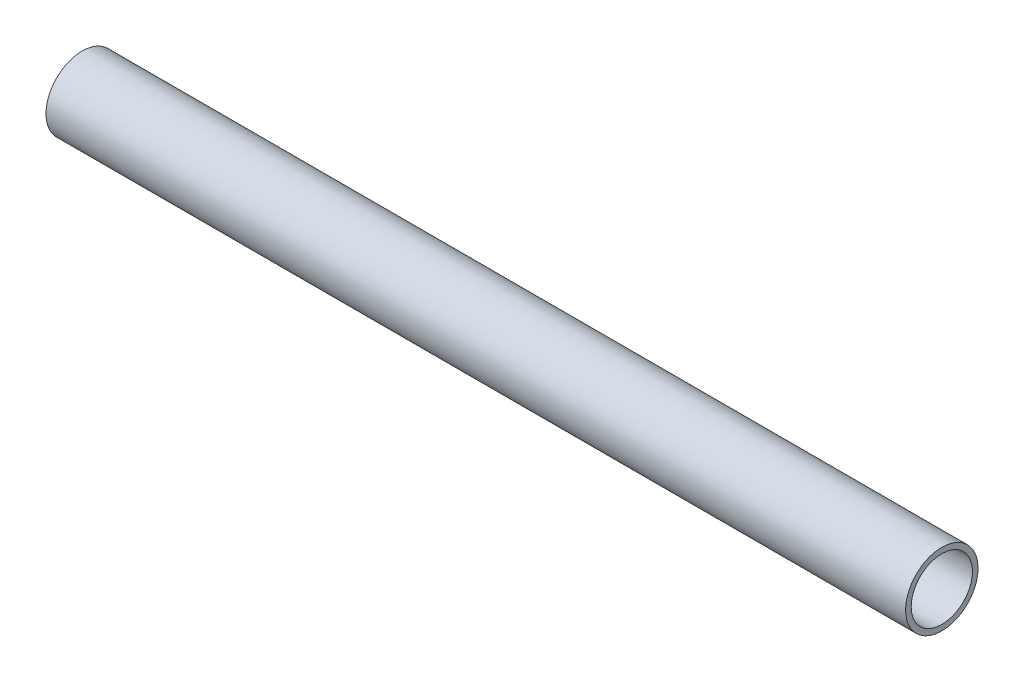
ISO-10303-21;
HEADER;
FILE_DESCRIPTION(('STEP AP214'),'2;1');
FILE_NAME('part.step','',(''),(''),'','','');
FILE_SCHEMA(('AUTOMOTIVE_DESIGN { 1 0 10303 214 1 1 1 1 }'));
ENDSEC;
DATA;
#1=APPLICATION_CONTEXT('core data for automotive mechanical design processes');
#2=APPLICATION_PROTOCOL_DEFINITION('international standard','automotive_design',2000,#1);
#3=PRODUCT_CONTEXT('',#1,'mechanical');
#4=PRODUCT('Part','Part','',(#3));
#5=PRODUCT_RELATED_PRODUCT_CATEGORY('part','',(#4));
#6=PRODUCT_DEFINITION_FORMATION('','',#4);
#7=PRODUCT_DEFINITION_CONTEXT('part definition',#1,'design');
#8=PRODUCT_DEFINITION('design','',#6,#7);
#9=PRODUCT_DEFINITION_SHAPE('','',#8);
#10=(LENGTH_UNIT() NAMED_UNIT(*) SI_UNIT(.MILLI.,.METRE.));
#11=(NAMED_UNIT(*) PLANE_ANGLE_UNIT() SI_UNIT($,.RADIAN.));
#12=(NAMED_UNIT(*) SI_UNIT($,.STERADIAN.) SOLID_ANGLE_UNIT());
#13=UNCERTAINTY_MEASURE_WITH_UNIT(LENGTH_MEASURE(1.E-05),#10,'distance_accuracy_value','');
#14=(GEOMETRIC_REPRESENTATION_CONTEXT(3) GLOBAL_UNCERTAINTY_ASSIGNED_CONTEXT((#13)) GLOBAL_UNIT_ASSIGNED_CONTEXT((#10,
#11,#12)) REPRESENTATION_CONTEXT('',''));
#15=CARTESIAN_POINT('',(0.,0.,0.));
#16=DIRECTION('',(0.,0.,1.));
#17=DIRECTION('',(1.,0.,0.));
#18=AXIS2_PLACEMENT_3D('',#15,#16,#17);
#19=CARTESIAN_POINT('',(42.0243,0.,0.));
#20=DIRECTION('',(1.,0.,0.));
#21=DIRECTION('',(0.,0.,-1.));
#22=AXIS2_PLACEMENT_3D('',#19,#20,#21);
#23=PLANE('',#22);
#24=CARTESIAN_POINT('',(42.0243,0.,0.));
#25=DIRECTION('',(1.,0.,0.));
#26=DIRECTION('',(0.,0.,-1.));
#27=AXIS2_PLACEMENT_3D('',#24,#25,#26);
#28=CIRCLE('',#27,3.5433);
#29=CARTESIAN_POINT('',(42.0243,0.,3.5433));
#30=VERTEX_POINT('',#29);
#31=EDGE_CURVE('E10',#30,#30,#28,.T.);
#32=ORIENTED_EDGE('',*,*,#31,.T.);
#33=EDGE_LOOP('',(#32));
#34=FACE_BOUND('',#33,.T.);
#35=CARTESIAN_POINT('',(42.0243,0.,0.));
#36=DIRECTION('',(1.,0.,0.));
#37=DIRECTION('',(0.,0.,-1.));
#38=AXIS2_PLACEMENT_3D('',#35,#36,#37);
#39=CIRCLE('',#38,2.99466);
#40=CARTESIAN_POINT('',(42.0243,0.,2.99466));
#41=VERTEX_POINT('',#40);
#42=EDGE_CURVE('E44',#41,#41,#39,.T.);
#43=ORIENTED_EDGE('',*,*,#42,.F.);
#44=EDGE_LOOP('',(#43));
#45=FACE_BOUND('',#44,.T.);
#46=ADVANCED_FACE('F33',(#34,#45),#23,.T.);
#47=CARTESIAN_POINT('',(-42.0243,0.,0.));
#48=DIRECTION('',(1.,0.,0.));
#49=DIRECTION('',(0.,0.,-1.));
#50=AXIS2_PLACEMENT_3D('',#47,#48,#49);
#51=PLANE('',#50);
#52=CARTESIAN_POINT('',(-42.0243,0.,0.));
#53=DIRECTION('',(1.,0.,0.));
#54=DIRECTION('',(0.,0.,-1.));
#55=AXIS2_PLACEMENT_3D('',#52,#53,#54);
#56=CIRCLE('',#55,3.5433);
#57=CARTESIAN_POINT('',(-42.0243,0.,3.5433));
#58=VERTEX_POINT('',#57);
#59=EDGE_CURVE('E37',#58,#58,#56,.T.);
#60=ORIENTED_EDGE('',*,*,#59,.F.);
#61=EDGE_LOOP('',(#60));
#62=FACE_BOUND('',#61,.T.);
#63=CARTESIAN_POINT('',(-42.0243,0.,0.));
#64=DIRECTION('',(1.,0.,0.));
#65=DIRECTION('',(0.,0.,-1.));
#66=AXIS2_PLACEMENT_3D('',#63,#64,#65);
#67=CIRCLE('',#66,2.99466);
#68=CARTESIAN_POINT('',(-42.0243,0.,2.99466));
#69=VERTEX_POINT('',#68);
#70=EDGE_CURVE('E46',#69,#69,#67,.T.);
#71=ORIENTED_EDGE('',*,*,#70,.T.);
#72=EDGE_LOOP('',(#71));
#73=FACE_BOUND('',#72,.T.);
#74=ADVANCED_FACE('F56',(#62,#73),#51,.F.);
#75=CARTESIAN_POINT('',(42.0243,0.,0.));
#76=DIRECTION('',(-1.,0.,0.));
#77=DIRECTION('',(0.,0.,1.));
#78=AXIS2_PLACEMENT_3D('',#75,#76,#77);
#79=CYLINDRICAL_SURFACE('',#78,3.5433);
#80=CARTESIAN_POINT('',(42.0243,0.,3.5433));
#81=CARTESIAN_POINT('',(41.14879375,0.,3.5433));
#82=CARTESIAN_POINT('',(40.2732875,0.,3.5433));
#83=CARTESIAN_POINT('',(38.522275,0.,3.5433));
#84=CARTESIAN_POINT('',(37.64676875,0.,3.5433));
#85=CARTESIAN_POINT('',(35.89575625,0.,3.5433));
#86=CARTESIAN_POINT('',(35.02025,0.,3.5433));
#87=CARTESIAN_POINT('',(33.2692375,0.,3.5433));
#88=CARTESIAN_POINT('',(32.39373125,0.,3.5433));
#89=CARTESIAN_POINT('',(30.64271875,0.,3.5433));
#90=CARTESIAN_POINT('',(29.7672125,0.,3.5433));
#91=CARTESIAN_POINT('',(28.0162,0.,3.5433));
#92=CARTESIAN_POINT('',(27.14069375,0.,3.5433));
#93=CARTESIAN_POINT('',(25.38968125,0.,3.5433));
#94=CARTESIAN_POINT('',(24.514175,0.,3.5433));
#95=CARTESIAN_POINT('',(22.7631625,0.,3.5433));
#96=CARTESIAN_POINT('',(21.88765625,0.,3.5433));
#97=CARTESIAN_POINT('',(20.13664375,0.,3.5433));
#98=CARTESIAN_POINT('',(19.2611375,0.,3.5433));
#99=CARTESIAN_POINT('',(17.510125,0.,3.5433));
#100=CARTESIAN_POINT('',(16.63461875,0.,3.5433));
#101=CARTESIAN_POINT('',(14.88360625,0.,3.5433));
#102=CARTESIAN_POINT('',(14.0081,0.,3.5433));
#103=CARTESIAN_POINT('',(12.2570875,0.,3.5433));
#104=CARTESIAN_POINT('',(11.38158125,0.,3.5433));
#105=CARTESIAN_POINT('',(9.63056875,0.,3.5433));
#106=CARTESIAN_POINT('',(8.7550625,0.,3.5433));
#107=CARTESIAN_POINT('',(7.00405,0.,3.5433));
#108=CARTESIAN_POINT('',(6.12854375,0.,3.5433));
#109=CARTESIAN_POINT('',(4.37753124999999,0.,3.5433));
#110=CARTESIAN_POINT('',(3.50202499999999,0.,3.5433));
#111=CARTESIAN_POINT('',(1.75101249999999,0.,3.5433));
#112=CARTESIAN_POINT('',(0.875506249999993,0.,3.5433));
#113=CARTESIAN_POINT('',(-0.875506250000007,0.,3.5433));
#114=CARTESIAN_POINT('',(-1.75101250000001,0.,3.5433));
#115=CARTESIAN_POINT('',(-3.50202500000001,0.,3.5433));
#116=CARTESIAN_POINT('',(-4.37753125000001,0.,3.5433));
#117=CARTESIAN_POINT('',(-6.12854375000001,0.,3.5433));
#118=CARTESIAN_POINT('',(-7.00405000000001,0.,3.5433));
#119=CARTESIAN_POINT('',(-8.75506250000001,0.,3.5433));
#120=CARTESIAN_POINT('',(-9.63056875000001,0.,3.5433));
#121=CARTESIAN_POINT('',(-11.38158125,0.,3.5433));
#122=CARTESIAN_POINT('',(-12.2570875,0.,3.5433));
#123=CARTESIAN_POINT('',(-14.0081,0.,3.5433));
#124=CARTESIAN_POINT('',(-14.88360625,0.,3.5433));
#125=CARTESIAN_POINT('',(-16.63461875,0.,3.5433));
#126=CARTESIAN_POINT('',(-17.510125,0.,3.5433));
#127=CARTESIAN_POINT('',(-19.2611375,0.,3.5433));
#128=CARTESIAN_POINT('',(-20.13664375,0.,3.5433));
#129=CARTESIAN_POINT('',(-21.88765625,0.,3.5433));
#130=CARTESIAN_POINT('',(-22.7631625,0.,3.5433));
#131=CARTESIAN_POINT('',(-24.514175,0.,3.5433));
#132=CARTESIAN_POINT('',(-25.38968125,0.,3.5433));
#133=CARTESIAN_POINT('',(-27.14069375,0.,3.5433));
#134=CARTESIAN_POINT('',(-28.0162,0.,3.5433));
#135=CARTESIAN_POINT('',(-29.7672125,0.,3.5433));
#136=CARTESIAN_POINT('',(-30.64271875,0.,3.5433));
#137=CARTESIAN_POINT('',(-32.39373125,0.,3.5433));
#138=CARTESIAN_POINT('',(-33.2692375,0.,3.5433));
#139=CARTESIAN_POINT('',(-35.02025,0.,3.5433));
#140=CARTESIAN_POINT('',(-35.89575625,0.,3.5433));
#141=CARTESIAN_POINT('',(-37.64676875,0.,3.5433));
#142=CARTESIAN_POINT('',(-38.522275,0.,3.5433));
#143=CARTESIAN_POINT('',(-40.2732875,0.,3.5433));
#144=CARTESIAN_POINT('',(-41.14879375,0.,3.5433));
#145=CARTESIAN_POINT('',(-42.0243,0.,3.5433));
#146=B_SPLINE_CURVE_WITH_KNOTS('',3,(#80,#81,#82,#83,#84,#85,#86,#87,#88,#89,#90,#91,#92,#93,
#94,#95,#96,#97,#98,#99,#100,#101,#102,#103,#104,#105,#106,#107,#108,#109,#110,#111,#112,#113,
#114,#115,#116,#117,#118,#119,#120,#121,#122,#123,#124,#125,#126,#127,#128,#129,#130,#131,#132,
#133,#134,#135,#136,#137,#138,#139,#140,#141,#142,#143,#144,#145),.UNSPECIFIED.,.F.,.F.,(4,2,2,
2,2,2,2,2,2,2,2,2,2,2,2,2,2,2,2,2,2,2,2,2,2,2,2,2,2,2,2,2,4),(0.,2.62651874999999,5.2530375,
7.87955625,10.506075,13.13259375,15.7591125,18.38563125,21.01215,23.63866875,26.2651875,
28.89170625,31.518225,34.14474375,36.7712625,39.39778125,42.0243,44.65081875,47.2773375,
49.90385625,52.530375,55.15689375,57.7834125,60.40993125,63.03645,65.66296875,68.2894875,
70.91600625,73.542525,76.16904375,78.7955625,81.42208125,84.0486),.UNSPECIFIED.);
#147=EDGE_CURVE('BSEAM35',#30,#58,#146,.T.);
#148=ORIENTED_EDGE('',*,*,#31,.F.);
#149=ORIENTED_EDGE('',*,*,#59,.T.);
#150=ORIENTED_EDGE('',*,*,#147,.T.);
#151=ORIENTED_EDGE('',*,*,#147,.F.);
#152=EDGE_LOOP('',(#148,#150,#149,#151));
#153=FACE_BOUND('',#152,.T.);
#154=ADVANCED_FACE('F35',(#153),#79,.T.);
#155=CARTESIAN_POINT('',(42.0243,0.,0.));
#156=DIRECTION('',(-1.,0.,0.));
#157=DIRECTION('',(0.,0.,1.));
#158=AXIS2_PLACEMENT_3D('',#155,#156,#157);
#159=CYLINDRICAL_SURFACE('',#158,2.99466);
#160=CARTESIAN_POINT('',(42.0243,0.,2.99466));
#161=CARTESIAN_POINT('',(41.14879375,0.,2.99466));
#162=CARTESIAN_POINT('',(40.2732875,0.,2.99466));
#163=CARTESIAN_POINT('',(38.522275,0.,2.99466));
#164=CARTESIAN_POINT('',(37.64676875,0.,2.99466));
#165=CARTESIAN_POINT('',(35.89575625,0.,2.99466));
#166=CARTESIAN_POINT('',(35.02025,0.,2.99466));
#167=CARTESIAN_POINT('',(33.2692375,0.,2.99466));
#168=CARTESIAN_POINT('',(32.39373125,0.,2.99466));
#169=CARTESIAN_POINT('',(30.64271875,0.,2.99466));
#170=CARTESIAN_POINT('',(29.7672125,0.,2.99466));
#171=CARTESIAN_POINT('',(28.0162,0.,2.99466));
#172=CARTESIAN_POINT('',(27.14069375,0.,2.99466));
#173=CARTESIAN_POINT('',(25.38968125,0.,2.99466));
#174=CARTESIAN_POINT('',(24.514175,0.,2.99466));
#175=CARTESIAN_POINT('',(22.7631625,0.,2.99466));
#176=CARTESIAN_POINT('',(21.88765625,0.,2.99466));
#177=CARTESIAN_POINT('',(20.13664375,0.,2.99466));
#178=CARTESIAN_POINT('',(19.2611375,0.,2.99466));
#179=CARTESIAN_POINT('',(17.510125,0.,2.99466));
#180=CARTESIAN_POINT('',(16.63461875,0.,2.99466));
#181=CARTESIAN_POINT('',(14.88360625,0.,2.99466));
#182=CARTESIAN_POINT('',(14.0081,0.,2.99466));
#183=CARTESIAN_POINT('',(12.2570875,0.,2.99466));
#184=CARTESIAN_POINT('',(11.38158125,0.,2.99466));
#185=CARTESIAN_POINT('',(9.63056875,0.,2.99466));
#186=CARTESIAN_POINT('',(8.7550625,0.,2.99466));
#187=CARTESIAN_POINT('',(7.00405,0.,2.99466));
#188=CARTESIAN_POINT('',(6.12854375,0.,2.99466));
#189=CARTESIAN_POINT('',(4.37753124999999,0.,2.99466));
#190=CARTESIAN_POINT('',(3.50202499999999,0.,2.99466));
#191=CARTESIAN_POINT('',(1.75101249999999,0.,2.99466));
#192=CARTESIAN_POINT('',(0.875506249999993,0.,2.99466));
#193=CARTESIAN_POINT('',(-0.875506250000007,0.,2.99466));
#194=CARTESIAN_POINT('',(-1.75101250000001,0.,2.99466));
#195=CARTESIAN_POINT('',(-3.50202500000001,0.,2.99466));
#196=CARTESIAN_POINT('',(-4.37753125000001,0.,2.99466));
#197=CARTESIAN_POINT('',(-6.12854375000001,0.,2.99466));
#198=CARTESIAN_POINT('',(-7.00405000000001,0.,2.99466));
#199=CARTESIAN_POINT('',(-8.75506250000001,0.,2.99466));
#200=CARTESIAN_POINT('',(-9.63056875000001,0.,2.99466));
#201=CARTESIAN_POINT('',(-11.38158125,0.,2.99466));
#202=CARTESIAN_POINT('',(-12.2570875,0.,2.99466));
#203=CARTESIAN_POINT('',(-14.0081,0.,2.99466));
#204=CARTESIAN_POINT('',(-14.88360625,0.,2.99466));
#205=CARTESIAN_POINT('',(-16.63461875,0.,2.99466));
#206=CARTESIAN_POINT('',(-17.510125,0.,2.99466));
#207=CARTESIAN_POINT('',(-19.2611375,0.,2.99466));
#208=CARTESIAN_POINT('',(-20.13664375,0.,2.99466));
#209=CARTESIAN_POINT('',(-21.88765625,0.,2.99466));
#210=CARTESIAN_POINT('',(-22.7631625,0.,2.99466));
#211=CARTESIAN_POINT('',(-24.514175,0.,2.99466));
#212=CARTESIAN_POINT('',(-25.38968125,0.,2.99466));
#213=CARTESIAN_POINT('',(-27.14069375,0.,2.99466));
#214=CARTESIAN_POINT('',(-28.0162,0.,2.99466));
#215=CARTESIAN_POINT('',(-29.7672125,0.,2.99466));
#216=CARTESIAN_POINT('',(-30.64271875,0.,2.99466));
#217=CARTESIAN_POINT('',(-32.39373125,0.,2.99466));
#218=CARTESIAN_POINT('',(-33.2692375,0.,2.99466));
#219=CARTESIAN_POINT('',(-35.02025,0.,2.99466));
#220=CARTESIAN_POINT('',(-35.89575625,0.,2.99466));
#221=CARTESIAN_POINT('',(-37.64676875,0.,2.99466));
#222=CARTESIAN_POINT('',(-38.522275,0.,2.99466));
#223=CARTESIAN_POINT('',(-40.2732875,0.,2.99466));
#224=CARTESIAN_POINT('',(-41.14879375,0.,2.99466));
#225=CARTESIAN_POINT('',(-42.0243,0.,2.99466));
#226=B_SPLINE_CURVE_WITH_KNOTS('',3,(#160,#161,#162,#163,#164,#165,#166,#167,#168,#169,#170,
#171,#172,#173,#174,#175,#176,#177,#178,#179,#180,#181,#182,#183,#184,#185,#186,#187,#188,#189,
#190,#191,#192,#193,#194,#195,#196,#197,#198,#199,#200,#201,#202,#203,#204,#205,#206,#207,#208,
#209,#210,#211,#212,#213,#214,#215,#216,#217,#218,#219,#220,#221,#222,#223,#224,#225),
.UNSPECIFIED.,.F.,.F.,(4,2,2,2,2,2,2,2,2,2,2,2,2,2,2,2,2,2,2,2,2,2,2,2,2,2,2,2,2,2,2,2,4),(0.,
2.62651874999999,5.2530375,7.87955625,10.506075,13.13259375,15.7591125,18.38563125,21.01215,
23.63866875,26.2651875,28.89170625,31.518225,34.14474375,36.7712625,39.39778125,42.0243,
44.65081875,47.2773375,49.90385625,52.530375,55.15689375,57.7834125,60.40993125,63.03645,
65.66296875,68.2894875,70.91600625,73.542525,76.16904375,78.7955625,81.42208125,84.0486),.UNSPECIFIED.);
#227=EDGE_CURVE('BSEAM52',#41,#69,#226,.T.);
#228=ORIENTED_EDGE('',*,*,#42,.T.);
#229=ORIENTED_EDGE('',*,*,#70,.F.);
#230=ORIENTED_EDGE('',*,*,#227,.T.);
#231=ORIENTED_EDGE('',*,*,#227,.F.);
#232=EDGE_LOOP('',(#228,#230,#229,#231));
#233=FACE_BOUND('',#232,.T.);
#234=ADVANCED_FACE('F52',(#233),#159,.F.);
#235=CLOSED_SHELL('',(#46,#74,#154,#234));
#236=MANIFOLD_SOLID_BREP('B2',#235);
#237=ADVANCED_BREP_SHAPE_REPRESENTATION('',(#18,#236),#14);
#238=SHAPE_DEFINITION_REPRESENTATION(#9,#237);
ENDSEC;
END-ISO-10303-21;
